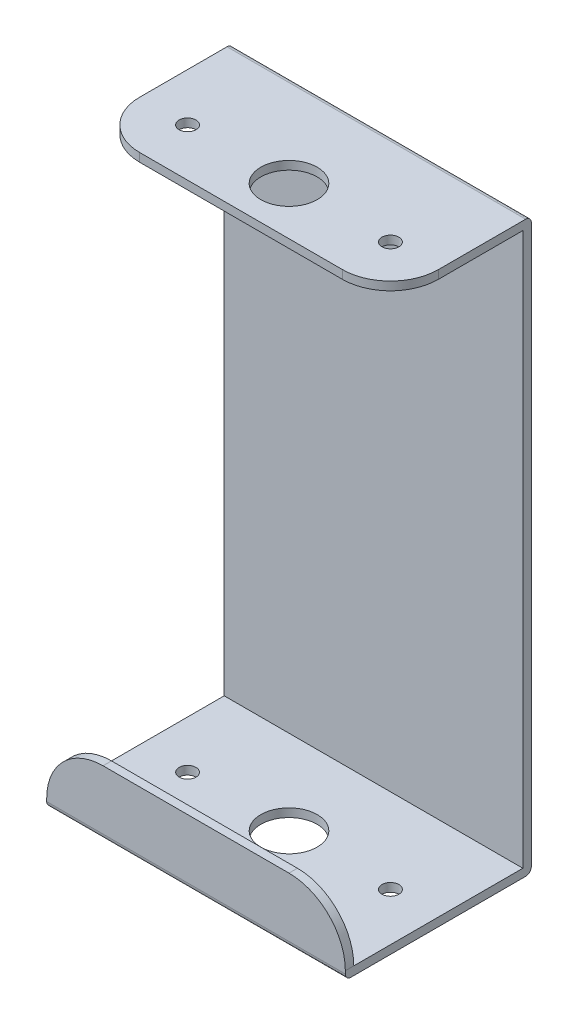
ISO-10303-21;
HEADER;
FILE_DESCRIPTION(('STEP AP214'),'2;1');
FILE_NAME('part.step','',(''),(''),'','','');
FILE_SCHEMA(('AUTOMOTIVE_DESIGN { 1 0 10303 214 1 1 1 1 }'));
ENDSEC;
DATA;
#1=APPLICATION_CONTEXT('core data for automotive mechanical design processes');
#2=APPLICATION_PROTOCOL_DEFINITION('international standard','automotive_design',2000,#1);
#3=PRODUCT_CONTEXT('',#1,'mechanical');
#4=PRODUCT('Part','Part','',(#3));
#5=PRODUCT_RELATED_PRODUCT_CATEGORY('part','',(#4));
#6=PRODUCT_DEFINITION_FORMATION('','',#4);
#7=PRODUCT_DEFINITION_CONTEXT('part definition',#1,'design');
#8=PRODUCT_DEFINITION('design','',#6,#7);
#9=PRODUCT_DEFINITION_SHAPE('','',#8);
#10=(LENGTH_UNIT() NAMED_UNIT(*) SI_UNIT(.MILLI.,.METRE.));
#11=(NAMED_UNIT(*) PLANE_ANGLE_UNIT() SI_UNIT($,.RADIAN.));
#12=(NAMED_UNIT(*) SI_UNIT($,.STERADIAN.) SOLID_ANGLE_UNIT());
#13=UNCERTAINTY_MEASURE_WITH_UNIT(LENGTH_MEASURE(1.E-05),#10,'distance_accuracy_value','');
#14=(GEOMETRIC_REPRESENTATION_CONTEXT(3) GLOBAL_UNCERTAINTY_ASSIGNED_CONTEXT((#13)) GLOBAL_UNIT_ASSIGNED_CONTEXT((#10,
#11,#12)) REPRESENTATION_CONTEXT('',''));
#15=CARTESIAN_POINT('',(0.,0.,0.));
#16=DIRECTION('',(0.,0.,1.));
#17=DIRECTION('',(1.,0.,0.));
#18=AXIS2_PLACEMENT_3D('',#15,#16,#17);
#19=CARTESIAN_POINT('',(-35.3950279955207,-47.290078387458,1.5));
#20=DIRECTION('',(-1.,0.,0.));
#21=DIRECTION('',(0.,0.,1.));
#22=AXIS2_PLACEMENT_3D('',#19,#20,#21);
#23=PLANE('',#22);
#24=DIRECTION('',(0.,1.,0.));
#25=VECTOR('',#24,1.);
#26=CARTESIAN_POINT('',(-35.3950279955207,-47.290078387458,33.));
#27=LINE('',#26,#25);
#28=CARTESIAN_POINT('',(-35.3950279955207,-46.290078387458,33.));
#29=VERTEX_POINT('',#28);
#30=CARTESIAN_POINT('',(-35.3950279955207,-45.790078387458,33.));
#31=VERTEX_POINT('',#30);
#32=EDGE_CURVE('E221',#29,#31,#27,.T.);
#33=ORIENTED_EDGE('',*,*,#32,.T.);
#34=DIRECTION('',(0.,0.,-1.));
#35=VECTOR('',#34,1.);
#36=CARTESIAN_POINT('',(-35.3950279955207,-45.790078387458,202.04901254514));
#37=LINE('',#36,#35);
#38=CARTESIAN_POINT('',(-35.3950279955207,-45.790078387458,31.5));
#39=VERTEX_POINT('',#38);
#40=EDGE_CURVE('E171',#31,#39,#37,.T.);
#41=ORIENTED_EDGE('',*,*,#40,.T.);
#42=DIRECTION('',(0.,0.,-1.));
#43=VECTOR('',#42,1.);
#44=CARTESIAN_POINT('',(-35.3950279955207,-45.790078387458,33.));
#45=LINE('',#44,#43);
#46=CARTESIAN_POINT('',(-35.3950279955207,-45.790078387458,1.5));
#47=VERTEX_POINT('',#46);
#48=EDGE_CURVE('E224',#39,#47,#45,.T.);
#49=ORIENTED_EDGE('',*,*,#48,.T.);
#50=DIRECTION('',(0.,1.,0.));
#51=VECTOR('',#50,1.);
#52=CARTESIAN_POINT('',(-35.3950279955207,-47.290078387458,1.5));
#53=LINE('',#52,#51);
#54=CARTESIAN_POINT('',(-35.3950279955207,52.209921612542,1.5));
#55=VERTEX_POINT('',#54);
#56=EDGE_CURVE('E241',#47,#55,#53,.T.);
#57=ORIENTED_EDGE('',*,*,#56,.T.);
#58=DIRECTION('',(0.,0.,-1.));
#59=VECTOR('',#58,1.);
#60=CARTESIAN_POINT('',(-35.3950279955207,52.209921612542,33.));
#61=LINE('',#60,#59);
#62=CARTESIAN_POINT('',(-35.3950279955207,52.209921612542,16.5));
#63=VERTEX_POINT('',#62);
#64=EDGE_CURVE('E235',#63,#55,#61,.T.);
#65=ORIENTED_EDGE('',*,*,#64,.F.);
#66=DIRECTION('',(0.,1.,0.));
#67=VECTOR('',#66,1.);
#68=CARTESIAN_POINT('',(-35.3950279955207,43.709921612542,16.5));
#69=LINE('',#68,#67);
#70=CARTESIAN_POINT('',(-35.3950279955207,53.709921612542,16.5));
#71=VERTEX_POINT('',#70);
#72=EDGE_CURVE('E185',#63,#71,#69,.T.);
#73=ORIENTED_EDGE('',*,*,#72,.T.);
#74=DIRECTION('',(0.,0.,-1.));
#75=VECTOR('',#74,1.);
#76=CARTESIAN_POINT('',(-35.3950279955207,53.709921612542,1.5));
#77=LINE('',#76,#75);
#78=CARTESIAN_POINT('',(-35.3950279955207,53.709921612542,1.));
#79=VERTEX_POINT('',#78);
#80=EDGE_CURVE('E249',#71,#79,#77,.T.);
#81=ORIENTED_EDGE('',*,*,#80,.T.);
#82=CARTESIAN_POINT('',(-35.3950279955207,52.709921612542,1.));
#83=DIRECTION('',(-1.,0.,0.));
#84=DIRECTION('',(0.,0.,1.));
#85=AXIS2_PLACEMENT_3D('',#82,#83,#84);
#86=CIRCLE('',#85,1.);
#87=CARTESIAN_POINT('',(-35.3950279955207,52.709921612542,0.));
#88=VERTEX_POINT('',#87);
#89=EDGE_CURVE('E268',#79,#88,#86,.T.);
#90=ORIENTED_EDGE('',*,*,#89,.T.);
#91=DIRECTION('',(0.,1.,0.));
#92=VECTOR('',#91,1.);
#93=CARTESIAN_POINT('',(-35.3950279955207,-47.290078387458,0.));
#94=LINE('',#93,#92);
#95=CARTESIAN_POINT('',(-35.3950279955207,-46.290078387458,0.));
#96=VERTEX_POINT('',#95);
#97=EDGE_CURVE('E242',#96,#88,#94,.T.);
#98=ORIENTED_EDGE('',*,*,#97,.F.);
#99=CARTESIAN_POINT('',(-35.3950279955207,-46.290078387458,1.));
#100=DIRECTION('',(-1.,0.,0.));
#101=DIRECTION('',(0.,0.,1.));
#102=AXIS2_PLACEMENT_3D('',#99,#100,#101);
#103=CIRCLE('',#102,1.);
#104=CARTESIAN_POINT('',(-35.3950279955207,-47.290078387458,1.));
#105=VERTEX_POINT('',#104);
#106=EDGE_CURVE('E287',#96,#105,#103,.T.);
#107=ORIENTED_EDGE('',*,*,#106,.T.);
#108=DIRECTION('',(0.,0.,-1.));
#109=VECTOR('',#108,1.);
#110=CARTESIAN_POINT('',(-35.3950279955207,-47.290078387458,1.5));
#111=LINE('',#110,#109);
#112=CARTESIAN_POINT('',(-35.3950279955207,-47.290078387458,32.));
#113=VERTEX_POINT('',#112);
#114=EDGE_CURVE('E245',#113,#105,#111,.T.);
#115=ORIENTED_EDGE('',*,*,#114,.F.);
#116=CARTESIAN_POINT('',(-35.3950279955207,-46.290078387458,32.));
#117=DIRECTION('',(-1.,0.,0.));
#118=DIRECTION('',(0.,0.,1.));
#119=AXIS2_PLACEMENT_3D('',#116,#117,#118);
#120=CIRCLE('',#119,1.);
#121=EDGE_CURVE('E299',#113,#29,#120,.T.);
#122=ORIENTED_EDGE('',*,*,#121,.T.);
#123=EDGE_LOOP('',(#33,#41,#49,#57,#65,#73,#81,#90,#98,#107,#115,#122));
#124=FACE_BOUND('',#123,.T.);
#125=ADVANCED_FACE('F33',(#124),#23,.T.);
#126=CARTESIAN_POINT('',(0.,0.,33.));
#127=DIRECTION('',(0.,0.,-1.));
#128=DIRECTION('',(-1.,0.,0.));
#129=AXIS2_PLACEMENT_3D('',#126,#127,#128);
#130=PLANE('',#129);
#131=DIRECTION('',(0.,-1.,0.));
#132=VECTOR('',#131,1.);
#133=CARTESIAN_POINT('',(17.6049720044793,-45.790078387458,33.));
#134=LINE('',#133,#132);
#135=CARTESIAN_POINT('',(17.6049720044793,-45.790078387458,33.));
#136=VERTEX_POINT('',#135);
#137=CARTESIAN_POINT('',(17.6049720044793,-46.290078387458,33.));
#138=VERTEX_POINT('',#137);
#139=EDGE_CURVE('E158',#136,#138,#134,.T.);
#140=ORIENTED_EDGE('',*,*,#139,.F.);
#141=CARTESIAN_POINT('',(7.60497200447925,-45.790078387458,33.));
#142=DIRECTION('',(0.,0.,-1.));
#143=DIRECTION('',(-1.,0.,0.));
#144=AXIS2_PLACEMENT_3D('',#141,#142,#143);
#145=CIRCLE('',#144,10.);
#146=CARTESIAN_POINT('',(7.60497200447925,-35.790078387458,33.));
#147=VERTEX_POINT('',#146);
#148=EDGE_CURVE('E155',#147,#136,#145,.T.);
#149=ORIENTED_EDGE('',*,*,#148,.F.);
#150=DIRECTION('',(1.,0.,0.));
#151=VECTOR('',#150,1.);
#152=CARTESIAN_POINT('',(-35.3950279955207,-35.790078387458,33.));
#153=LINE('',#152,#151);
#154=CARTESIAN_POINT('',(-25.3950279955207,-35.790078387458,33.));
#155=VERTEX_POINT('',#154);
#156=EDGE_CURVE('E144',#155,#147,#153,.T.);
#157=ORIENTED_EDGE('',*,*,#156,.F.);
#158=CARTESIAN_POINT('',(-25.3950279955207,-45.790078387458,33.));
#159=DIRECTION('',(0.,0.,-1.));
#160=DIRECTION('',(-1.,0.,0.));
#161=AXIS2_PLACEMENT_3D('',#158,#159,#160);
#162=CIRCLE('',#161,10.);
#163=EDGE_CURVE('E168',#155,#31,#162,.F.);
#164=ORIENTED_EDGE('',*,*,#163,.T.);
#165=ORIENTED_EDGE('',*,*,#32,.F.);
#166=DIRECTION('',(-1.,0.,0.));
#167=VECTOR('',#166,1.);
#168=CARTESIAN_POINT('',(0.,-46.290078387458,33.));
#169=LINE('',#168,#167);
#170=EDGE_CURVE('E295',#29,#138,#169,.F.);
#171=ORIENTED_EDGE('',*,*,#170,.T.);
#172=EDGE_LOOP('',(#140,#149,#157,#164,#165,#171));
#173=FACE_BOUND('',#172,.T.);
#174=ADVANCED_FACE('F156',(#173),#130,.F.);
#175=CARTESIAN_POINT('',(17.6049720044793,-35.790078387458,31.5));
#176=DIRECTION('',(0.,0.,1.));
#177=DIRECTION('',(1.,0.,0.));
#178=AXIS2_PLACEMENT_3D('',#175,#176,#177);
#179=PLANE('',#178);
#180=DIRECTION('',(-1.,0.,0.));
#181=VECTOR('',#180,1.);
#182=CARTESIAN_POINT('',(17.6049720044793,-35.790078387458,31.5));
#183=LINE('',#182,#181);
#184=CARTESIAN_POINT('',(7.60497200447925,-35.790078387458,31.5));
#185=VERTEX_POINT('',#184);
#186=CARTESIAN_POINT('',(-25.3950279955207,-35.790078387458,31.5));
#187=VERTEX_POINT('',#186);
#188=EDGE_CURVE('E152',#185,#187,#183,.T.);
#189=ORIENTED_EDGE('',*,*,#188,.F.);
#190=CARTESIAN_POINT('',(7.60497200447925,-45.790078387458,31.5));
#191=DIRECTION('',(0.,0.,1.));
#192=DIRECTION('',(1.,0.,0.));
#193=AXIS2_PLACEMENT_3D('',#190,#191,#192);
#194=CIRCLE('',#193,10.);
#195=CARTESIAN_POINT('',(17.6049720044793,-45.790078387458,31.5));
#196=VERTEX_POINT('',#195);
#197=EDGE_CURVE('E163',#185,#196,#194,.F.);
#198=ORIENTED_EDGE('',*,*,#197,.T.);
#199=DIRECTION('',(-1.,0.,0.));
#200=VECTOR('',#199,1.);
#201=CARTESIAN_POINT('',(17.6049720044793,-45.790078387458,31.5));
#202=LINE('',#201,#200);
#203=EDGE_CURVE('E215',#196,#39,#202,.T.);
#204=ORIENTED_EDGE('',*,*,#203,.T.);
#205=CARTESIAN_POINT('',(-25.3950279955207,-45.790078387458,31.5));
#206=DIRECTION('',(0.,0.,1.));
#207=DIRECTION('',(1.,0.,0.));
#208=AXIS2_PLACEMENT_3D('',#205,#206,#207);
#209=CIRCLE('',#208,10.);
#210=EDGE_CURVE('E173',#187,#39,#209,.T.);
#211=ORIENTED_EDGE('',*,*,#210,.F.);
#212=EDGE_LOOP('',(#189,#198,#204,#211));
#213=FACE_BOUND('',#212,.T.);
#214=ADVANCED_FACE('F341',(#213),#179,.F.);
#215=CARTESIAN_POINT('',(17.6049720044793,-47.290078387458,1.5));
#216=DIRECTION('',(-1.,0.,0.));
#217=DIRECTION('',(0.,0.,1.));
#218=AXIS2_PLACEMENT_3D('',#215,#216,#217);
#219=PLANE('',#218);
#220=DIRECTION('',(0.,0.,-1.));
#221=VECTOR('',#220,1.);
#222=CARTESIAN_POINT('',(17.6049720044793,-45.790078387458,33.));
#223=LINE('',#222,#221);
#224=CARTESIAN_POINT('',(17.6049720044793,-45.790078387458,1.5));
#225=VERTEX_POINT('',#224);
#226=EDGE_CURVE('E228',#196,#225,#223,.T.);
#227=ORIENTED_EDGE('',*,*,#226,.F.);
#228=DIRECTION('',(0.,0.,-1.));
#229=VECTOR('',#228,1.);
#230=CARTESIAN_POINT('',(17.6049720044793,-45.790078387458,181.42401254514));
#231=LINE('',#230,#229);
#232=EDGE_CURVE('E48',#136,#196,#231,.T.);
#233=ORIENTED_EDGE('',*,*,#232,.F.);
#234=ORIENTED_EDGE('',*,*,#139,.T.);
#235=CARTESIAN_POINT('',(17.6049720044793,-46.290078387458,32.));
#236=DIRECTION('',(-1.,0.,0.));
#237=DIRECTION('',(0.,0.,1.));
#238=AXIS2_PLACEMENT_3D('',#235,#236,#237);
#239=CIRCLE('',#238,1.);
#240=CARTESIAN_POINT('',(17.6049720044793,-47.290078387458,32.));
#241=VERTEX_POINT('',#240);
#242=EDGE_CURVE('E297',#138,#241,#239,.F.);
#243=ORIENTED_EDGE('',*,*,#242,.T.);
#244=DIRECTION('',(0.,0.,-1.));
#245=VECTOR('',#244,1.);
#246=CARTESIAN_POINT('',(17.6049720044793,-47.290078387458,1.5));
#247=LINE('',#246,#245);
#248=CARTESIAN_POINT('',(17.6049720044793,-47.290078387458,1.));
#249=VERTEX_POINT('',#248);
#250=EDGE_CURVE('E253',#241,#249,#247,.T.);
#251=ORIENTED_EDGE('',*,*,#250,.T.);
#252=CARTESIAN_POINT('',(17.6049720044793,-46.290078387458,1.));
#253=DIRECTION('',(-1.,0.,0.));
#254=DIRECTION('',(0.,0.,1.));
#255=AXIS2_PLACEMENT_3D('',#252,#253,#254);
#256=CIRCLE('',#255,1.);
#257=CARTESIAN_POINT('',(17.6049720044793,-46.290078387458,0.));
#258=VERTEX_POINT('',#257);
#259=EDGE_CURVE('E290',#249,#258,#256,.F.);
#260=ORIENTED_EDGE('',*,*,#259,.T.);
#261=DIRECTION('',(0.,1.,0.));
#262=VECTOR('',#261,1.);
#263=CARTESIAN_POINT('',(17.6049720044793,-47.290078387458,0.));
#264=LINE('',#263,#262);
#265=CARTESIAN_POINT('',(17.6049720044793,52.709921612542,0.));
#266=VERTEX_POINT('',#265);
#267=EDGE_CURVE('E237',#258,#266,#264,.T.);
#268=ORIENTED_EDGE('',*,*,#267,.T.);
#269=CARTESIAN_POINT('',(17.6049720044793,52.709921612542,1.));
#270=DIRECTION('',(-1.,0.,0.));
#271=DIRECTION('',(0.,0.,1.));
#272=AXIS2_PLACEMENT_3D('',#269,#270,#271);
#273=CIRCLE('',#272,1.);
#274=CARTESIAN_POINT('',(17.6049720044793,53.709921612542,1.));
#275=VERTEX_POINT('',#274);
#276=EDGE_CURVE('E271',#266,#275,#273,.F.);
#277=ORIENTED_EDGE('',*,*,#276,.T.);
#278=DIRECTION('',(0.,0.,-1.));
#279=VECTOR('',#278,1.);
#280=CARTESIAN_POINT('',(17.6049720044793,53.709921612542,1.5));
#281=LINE('',#280,#279);
#282=CARTESIAN_POINT('',(17.6049720044793,53.709921612542,16.5));
#283=VERTEX_POINT('',#282);
#284=EDGE_CURVE('E251',#283,#275,#281,.T.);
#285=ORIENTED_EDGE('',*,*,#284,.F.);
#286=DIRECTION('',(0.,1.,0.));
#287=VECTOR('',#286,1.);
#288=CARTESIAN_POINT('',(17.6049720044793,43.709921612542,16.5));
#289=LINE('',#288,#287);
#290=CARTESIAN_POINT('',(17.6049720044793,52.209921612542,16.5));
#291=VERTEX_POINT('',#290);
#292=EDGE_CURVE('E191',#291,#283,#289,.T.);
#293=ORIENTED_EDGE('',*,*,#292,.F.);
#294=DIRECTION('',(0.,0.,-1.));
#295=VECTOR('',#294,1.);
#296=CARTESIAN_POINT('',(17.6049720044793,52.209921612542,33.));
#297=LINE('',#296,#295);
#298=CARTESIAN_POINT('',(17.6049720044793,52.209921612542,1.5));
#299=VERTEX_POINT('',#298);
#300=EDGE_CURVE('E233',#291,#299,#297,.T.);
#301=ORIENTED_EDGE('',*,*,#300,.T.);
#302=DIRECTION('',(0.,1.,0.));
#303=VECTOR('',#302,1.);
#304=CARTESIAN_POINT('',(17.6049720044793,-47.290078387458,1.5));
#305=LINE('',#304,#303);
#306=EDGE_CURVE('E238',#225,#299,#305,.T.);
#307=ORIENTED_EDGE('',*,*,#306,.F.);
#308=EDGE_LOOP('',(#227,#233,#234,#243,#251,#260,#268,#277,#285,#293,#301,#307));
#309=FACE_BOUND('',#308,.T.);
#310=ADVANCED_FACE('F318',(#309),#219,.F.);
#311=CARTESIAN_POINT('',(-35.3950279955207,53.709921612542,1.5));
#312=DIRECTION('',(0.,1.,0.));
#313=DIRECTION('',(0.,0.,1.));
#314=AXIS2_PLACEMENT_3D('',#311,#312,#313);
#315=PLANE('',#314);
#316=CARTESIAN_POINT('',(-26.8950279955207,53.709921612542,16.5));
#317=DIRECTION('',(0.,1.,0.));
#318=DIRECTION('',(0.,0.,1.));
#319=AXIS2_PLACEMENT_3D('',#316,#317,#318);
#320=CIRCLE('',#319,1.5);
#321=CARTESIAN_POINT('',(-26.8950279955207,53.709921612542,18.));
#322=VERTEX_POINT('',#321);
#323=EDGE_CURVE('E208',#322,#322,#320,.T.);
#324=ORIENTED_EDGE('',*,*,#323,.F.);
#325=EDGE_LOOP('',(#324));
#326=FACE_BOUND('',#325,.T.);
#327=CARTESIAN_POINT('',(9.10497200447925,53.709921612542,16.5));
#328=DIRECTION('',(0.,1.,0.));
#329=DIRECTION('',(0.,0.,1.));
#330=AXIS2_PLACEMENT_3D('',#327,#328,#329);
#331=CIRCLE('',#330,1.5);
#332=CARTESIAN_POINT('',(9.10497200447925,53.709921612542,18.));
#333=VERTEX_POINT('',#332);
#334=EDGE_CURVE('E204',#333,#333,#331,.T.);
#335=ORIENTED_EDGE('',*,*,#334,.F.);
#336=EDGE_LOOP('',(#335));
#337=FACE_BOUND('',#336,.T.);
#338=CARTESIAN_POINT('',(-8.89502799552074,53.709921612542,16.5));
#339=DIRECTION('',(0.,1.,0.));
#340=DIRECTION('',(0.,0.,1.));
#341=AXIS2_PLACEMENT_3D('',#338,#339,#340);
#342=CIRCLE('',#341,5.);
#343=CARTESIAN_POINT('',(-8.89502799552074,53.709921612542,21.5));
#344=VERTEX_POINT('',#343);
#345=EDGE_CURVE('E207',#344,#344,#342,.T.);
#346=ORIENTED_EDGE('',*,*,#345,.F.);
#347=EDGE_LOOP('',(#346));
#348=FACE_BOUND('',#347,.T.);
#349=ORIENTED_EDGE('',*,*,#80,.F.);
#350=CARTESIAN_POINT('',(-26.8950279955207,53.709921612542,16.5));
#351=DIRECTION('',(0.,1.,0.));
#352=DIRECTION('',(0.,0.,1.));
#353=AXIS2_PLACEMENT_3D('',#350,#351,#352);
#354=CIRCLE('',#353,8.5);
#355=CARTESIAN_POINT('',(-26.8950279955207,53.709921612542,25.));
#356=VERTEX_POINT('',#355);
#357=EDGE_CURVE('E176',#71,#356,#354,.T.);
#358=ORIENTED_EDGE('',*,*,#357,.T.);
#359=DIRECTION('',(1.,0.,0.));
#360=VECTOR('',#359,1.);
#361=CARTESIAN_POINT('',(0.,53.709921612542,25.));
#362=LINE('',#361,#360);
#363=CARTESIAN_POINT('',(9.10497200447925,53.709921612542,25.));
#364=VERTEX_POINT('',#363);
#365=EDGE_CURVE('E182',#356,#364,#362,.T.);
#366=ORIENTED_EDGE('',*,*,#365,.T.);
#367=CARTESIAN_POINT('',(9.10497200447925,53.709921612542,16.5));
#368=DIRECTION('',(0.,1.,0.));
#369=DIRECTION('',(0.,0.,1.));
#370=AXIS2_PLACEMENT_3D('',#367,#368,#369);
#371=CIRCLE('',#370,8.5);
#372=EDGE_CURVE('E179',#364,#283,#371,.T.);
#373=ORIENTED_EDGE('',*,*,#372,.T.);
#374=ORIENTED_EDGE('',*,*,#284,.T.);
#375=DIRECTION('',(1.,0.,0.));
#376=VECTOR('',#375,1.);
#377=CARTESIAN_POINT('',(0.,53.709921612542,1.));
#378=LINE('',#377,#376);
#379=EDGE_CURVE('E265',#275,#79,#378,.F.);
#380=ORIENTED_EDGE('',*,*,#379,.T.);
#381=EDGE_LOOP('',(#349,#358,#366,#373,#374,#380));
#382=FACE_BOUND('',#381,.T.);
#383=ADVANCED_FACE('F324',(#326,#337,#348,#382),#315,.T.);
#384=CARTESIAN_POINT('',(-35.3950279955207,52.209921612542,33.));
#385=DIRECTION('',(0.,1.,0.));
#386=DIRECTION('',(0.,0.,1.));
#387=AXIS2_PLACEMENT_3D('',#384,#385,#386);
#388=PLANE('',#387);
#389=CARTESIAN_POINT('',(-8.89502799552074,52.209921612542,16.5));
#390=DIRECTION('',(0.,1.,0.));
#391=DIRECTION('',(0.,0.,1.));
#392=AXIS2_PLACEMENT_3D('',#389,#390,#391);
#393=CIRCLE('',#392,5.);
#394=CARTESIAN_POINT('',(-8.89502799552074,52.209921612542,21.5));
#395=VERTEX_POINT('',#394);
#396=EDGE_CURVE('E214',#395,#395,#393,.T.);
#397=ORIENTED_EDGE('',*,*,#396,.T.);
#398=EDGE_LOOP('',(#397));
#399=FACE_BOUND('',#398,.T.);
#400=CARTESIAN_POINT('',(9.10497200447925,52.209921612542,16.5));
#401=DIRECTION('',(0.,1.,0.));
#402=DIRECTION('',(0.,0.,1.));
#403=AXIS2_PLACEMENT_3D('',#400,#401,#402);
#404=CIRCLE('',#403,1.5);
#405=CARTESIAN_POINT('',(9.10497200447925,52.209921612542,18.));
#406=VERTEX_POINT('',#405);
#407=EDGE_CURVE('E258',#406,#406,#404,.T.);
#408=ORIENTED_EDGE('',*,*,#407,.T.);
#409=EDGE_LOOP('',(#408));
#410=FACE_BOUND('',#409,.T.);
#411=CARTESIAN_POINT('',(-26.8950279955207,52.209921612542,16.5));
#412=DIRECTION('',(0.,1.,0.));
#413=DIRECTION('',(0.,0.,1.));
#414=AXIS2_PLACEMENT_3D('',#411,#412,#413);
#415=CIRCLE('',#414,1.5);
#416=CARTESIAN_POINT('',(-26.8950279955207,52.209921612542,18.));
#417=VERTEX_POINT('',#416);
#418=EDGE_CURVE('E219',#417,#417,#415,.T.);
#419=ORIENTED_EDGE('',*,*,#418,.T.);
#420=EDGE_LOOP('',(#419));
#421=FACE_BOUND('',#420,.T.);
#422=CARTESIAN_POINT('',(-26.8950279955207,52.209921612542,16.5));
#423=DIRECTION('',(0.,1.,0.));
#424=DIRECTION('',(0.,0.,1.));
#425=AXIS2_PLACEMENT_3D('',#422,#423,#424);
#426=CIRCLE('',#425,8.5);
#427=CARTESIAN_POINT('',(-26.8950279955207,52.209921612542,25.));
#428=VERTEX_POINT('',#427);
#429=EDGE_CURVE('E11',#63,#428,#426,.T.);
#430=ORIENTED_EDGE('',*,*,#429,.F.);
#431=ORIENTED_EDGE('',*,*,#64,.T.);
#432=DIRECTION('',(1.,0.,0.));
#433=VECTOR('',#432,1.);
#434=CARTESIAN_POINT('',(-35.3950279955207,52.209921612542,1.5));
#435=LINE('',#434,#433);
#436=EDGE_CURVE('E230',#55,#299,#435,.T.);
#437=ORIENTED_EDGE('',*,*,#436,.T.);
#438=ORIENTED_EDGE('',*,*,#300,.F.);
#439=CARTESIAN_POINT('',(9.10497200447925,52.209921612542,16.5));
#440=DIRECTION('',(0.,1.,0.));
#441=DIRECTION('',(0.,0.,1.));
#442=AXIS2_PLACEMENT_3D('',#439,#440,#441);
#443=CIRCLE('',#442,8.5);
#444=CARTESIAN_POINT('',(9.10497200447925,52.209921612542,25.));
#445=VERTEX_POINT('',#444);
#446=EDGE_CURVE('E301',#445,#291,#443,.T.);
#447=ORIENTED_EDGE('',*,*,#446,.F.);
#448=DIRECTION('',(1.,0.,0.));
#449=VECTOR('',#448,1.);
#450=CARTESIAN_POINT('',(-35.3950279955207,52.209921612542,25.));
#451=LINE('',#450,#449);
#452=EDGE_CURVE('E41',#428,#445,#451,.T.);
#453=ORIENTED_EDGE('',*,*,#452,.F.);
#454=EDGE_LOOP('',(#430,#431,#437,#438,#447,#453));
#455=FACE_BOUND('',#454,.T.);
#456=ADVANCED_FACE('F313',(#399,#410,#421,#455),#388,.F.);
#457=CARTESIAN_POINT('',(-35.3950279955207,-46.290078387458,32.));
#458=DIRECTION('',(-1.,0.,0.));
#459=DIRECTION('',(0.,0.,1.));
#460=AXIS2_PLACEMENT_3D('',#457,#458,#459);
#461=CYLINDRICAL_SURFACE('',#460,1.);
#462=DIRECTION('',(-1.,0.,0.));
#463=VECTOR('',#462,1.);
#464=CARTESIAN_POINT('',(-35.3950279955207,-47.290078387458,32.));
#465=LINE('',#464,#463);
#466=EDGE_CURVE('E292',#241,#113,#465,.T.);
#467=ORIENTED_EDGE('',*,*,#466,.F.);
#468=ORIENTED_EDGE('',*,*,#242,.F.);
#469=ORIENTED_EDGE('',*,*,#170,.F.);
#470=ORIENTED_EDGE('',*,*,#121,.F.);
#471=EDGE_LOOP('',(#467,#468,#469,#470));
#472=FACE_BOUND('',#471,.T.);
#473=ADVANCED_FACE('F35',(#472),#461,.T.);
#474=CARTESIAN_POINT('',(-35.3950279955207,-46.290078387458,1.));
#475=DIRECTION('',(1.,0.,0.));
#476=DIRECTION('',(0.,0.,-1.));
#477=AXIS2_PLACEMENT_3D('',#474,#475,#476);
#478=CYLINDRICAL_SURFACE('',#477,1.);
#479=DIRECTION('',(1.,0.,0.));
#480=VECTOR('',#479,1.);
#481=CARTESIAN_POINT('',(-35.3950279955207,-47.290078387458,1.));
#482=LINE('',#481,#480);
#483=EDGE_CURVE('E274',#105,#249,#482,.T.);
#484=ORIENTED_EDGE('',*,*,#483,.F.);
#485=ORIENTED_EDGE('',*,*,#106,.F.);
#486=DIRECTION('',(1.,0.,0.));
#487=VECTOR('',#486,1.);
#488=CARTESIAN_POINT('',(0.,-46.290078387458,0.));
#489=LINE('',#488,#487);
#490=EDGE_CURVE('E284',#258,#96,#489,.F.);
#491=ORIENTED_EDGE('',*,*,#490,.F.);
#492=ORIENTED_EDGE('',*,*,#259,.F.);
#493=EDGE_LOOP('',(#484,#485,#491,#492));
#494=FACE_BOUND('',#493,.T.);
#495=ADVANCED_FACE('F357',(#494),#478,.T.);
#496=CARTESIAN_POINT('',(0.,52.709921612542,1.));
#497=DIRECTION('',(-1.,0.,0.));
#498=DIRECTION('',(0.,0.,1.));
#499=AXIS2_PLACEMENT_3D('',#496,#497,#498);
#500=CYLINDRICAL_SURFACE('',#499,1.);
#501=DIRECTION('',(1.,0.,0.));
#502=VECTOR('',#501,1.);
#503=CARTESIAN_POINT('',(0.,52.709921612542,0.));
#504=LINE('',#503,#502);
#505=EDGE_CURVE('E255',#88,#266,#504,.T.);
#506=ORIENTED_EDGE('',*,*,#505,.F.);
#507=ORIENTED_EDGE('',*,*,#89,.F.);
#508=ORIENTED_EDGE('',*,*,#379,.F.);
#509=ORIENTED_EDGE('',*,*,#276,.F.);
#510=EDGE_LOOP('',(#506,#507,#508,#509));
#511=FACE_BOUND('',#510,.T.);
#512=ADVANCED_FACE('F365',(#511),#500,.T.);
#513=CARTESIAN_POINT('',(-35.3950279955207,-45.790078387458,33.));
#514=DIRECTION('',(0.,1.,0.));
#515=DIRECTION('',(0.,0.,1.));
#516=AXIS2_PLACEMENT_3D('',#513,#514,#515);
#517=PLANE('',#516);
#518=CARTESIAN_POINT('',(9.10497200447925,-45.790078387458,16.5));
#519=DIRECTION('',(0.,1.,0.));
#520=DIRECTION('',(0.,0.,1.));
#521=AXIS2_PLACEMENT_3D('',#518,#519,#520);
#522=CIRCLE('',#521,1.5);
#523=CARTESIAN_POINT('',(9.10497200447925,-45.790078387458,18.));
#524=VERTEX_POINT('',#523);
#525=EDGE_CURVE('E188',#524,#524,#522,.T.);
#526=ORIENTED_EDGE('',*,*,#525,.F.);
#527=EDGE_LOOP('',(#526));
#528=FACE_BOUND('',#527,.T.);
#529=CARTESIAN_POINT('',(-26.8950279955207,-45.790078387458,16.5));
#530=DIRECTION('',(0.,1.,0.));
#531=DIRECTION('',(0.,0.,1.));
#532=AXIS2_PLACEMENT_3D('',#529,#530,#531);
#533=CIRCLE('',#532,1.5);
#534=CARTESIAN_POINT('',(-26.8950279955207,-45.790078387458,18.));
#535=VERTEX_POINT('',#534);
#536=EDGE_CURVE('E195',#535,#535,#533,.T.);
#537=ORIENTED_EDGE('',*,*,#536,.F.);
#538=EDGE_LOOP('',(#537));
#539=FACE_BOUND('',#538,.T.);
#540=CARTESIAN_POINT('',(-8.89502799552075,-45.790078387458,16.5));
#541=DIRECTION('',(0.,1.,0.));
#542=DIRECTION('',(0.,0.,1.));
#543=AXIS2_PLACEMENT_3D('',#540,#541,#542);
#544=CIRCLE('',#543,5.);
#545=CARTESIAN_POINT('',(-8.89502799552075,-45.790078387458,21.5));
#546=VERTEX_POINT('',#545);
#547=EDGE_CURVE('E198',#546,#546,#544,.T.);
#548=ORIENTED_EDGE('',*,*,#547,.F.);
#549=EDGE_LOOP('',(#548));
#550=FACE_BOUND('',#549,.T.);
#551=ORIENTED_EDGE('',*,*,#48,.F.);
#552=ORIENTED_EDGE('',*,*,#203,.F.);
#553=ORIENTED_EDGE('',*,*,#226,.T.);
#554=DIRECTION('',(1.,0.,0.));
#555=VECTOR('',#554,1.);
#556=CARTESIAN_POINT('',(-35.3950279955207,-45.790078387458,1.5));
#557=LINE('',#556,#555);
#558=EDGE_CURVE('E151',#47,#225,#557,.T.);
#559=ORIENTED_EDGE('',*,*,#558,.F.);
#560=EDGE_LOOP('',(#551,#552,#553,#559));
#561=FACE_BOUND('',#560,.T.);
#562=ADVANCED_FACE('F338',(#528,#539,#550,#561),#517,.T.);
#563=CARTESIAN_POINT('',(-35.3950279955207,-47.290078387458,1.5));
#564=DIRECTION('',(0.,1.,0.));
#565=DIRECTION('',(0.,0.,1.));
#566=AXIS2_PLACEMENT_3D('',#563,#564,#565);
#567=PLANE('',#566);
#568=CARTESIAN_POINT('',(9.10497200447925,-47.290078387458,16.5));
#569=DIRECTION('',(0.,1.,0.));
#570=DIRECTION('',(0.,0.,1.));
#571=AXIS2_PLACEMENT_3D('',#568,#569,#570);
#572=CIRCLE('',#571,1.5);
#573=CARTESIAN_POINT('',(9.10497200447925,-47.290078387458,18.));
#574=VERTEX_POINT('',#573);
#575=EDGE_CURVE('E211',#574,#574,#572,.T.);
#576=ORIENTED_EDGE('',*,*,#575,.T.);
#577=EDGE_LOOP('',(#576));
#578=FACE_BOUND('',#577,.T.);
#579=CARTESIAN_POINT('',(-26.8950279955207,-47.290078387458,16.5));
#580=DIRECTION('',(0.,1.,0.));
#581=DIRECTION('',(0.,0.,1.));
#582=AXIS2_PLACEMENT_3D('',#579,#580,#581);
#583=CIRCLE('',#582,1.5);
#584=CARTESIAN_POINT('',(-26.8950279955207,-47.290078387458,18.));
#585=VERTEX_POINT('',#584);
#586=EDGE_CURVE('E277',#585,#585,#583,.T.);
#587=ORIENTED_EDGE('',*,*,#586,.T.);
#588=EDGE_LOOP('',(#587));
#589=FACE_BOUND('',#588,.T.);
#590=CARTESIAN_POINT('',(-8.89502799552075,-47.290078387458,16.5));
#591=DIRECTION('',(0.,1.,0.));
#592=DIRECTION('',(0.,0.,1.));
#593=AXIS2_PLACEMENT_3D('',#590,#591,#592);
#594=CIRCLE('',#593,5.);
#595=CARTESIAN_POINT('',(-8.89502799552075,-47.290078387458,21.5));
#596=VERTEX_POINT('',#595);
#597=EDGE_CURVE('E203',#596,#596,#594,.T.);
#598=ORIENTED_EDGE('',*,*,#597,.T.);
#599=EDGE_LOOP('',(#598));
#600=FACE_BOUND('',#599,.T.);
#601=ORIENTED_EDGE('',*,*,#250,.F.);
#602=ORIENTED_EDGE('',*,*,#466,.T.);
#603=ORIENTED_EDGE('',*,*,#114,.T.);
#604=ORIENTED_EDGE('',*,*,#483,.T.);
#605=EDGE_LOOP('',(#601,#602,#603,#604));
#606=FACE_BOUND('',#605,.T.);
#607=ADVANCED_FACE('F359',(#578,#589,#600,#606),#567,.F.);
#608=CARTESIAN_POINT('',(0.,0.,1.5));
#609=DIRECTION('',(0.,0.,1.));
#610=DIRECTION('',(1.,0.,0.));
#611=AXIS2_PLACEMENT_3D('',#608,#609,#610);
#612=PLANE('',#611);
#613=ORIENTED_EDGE('',*,*,#558,.T.);
#614=ORIENTED_EDGE('',*,*,#306,.T.);
#615=ORIENTED_EDGE('',*,*,#436,.F.);
#616=ORIENTED_EDGE('',*,*,#56,.F.);
#617=EDGE_LOOP('',(#613,#614,#615,#616));
#618=FACE_BOUND('',#617,.T.);
#619=ADVANCED_FACE('F333',(#618),#612,.T.);
#620=CARTESIAN_POINT('',(0.,0.,0.));
#621=DIRECTION('',(0.,0.,1.));
#622=DIRECTION('',(1.,0.,0.));
#623=AXIS2_PLACEMENT_3D('',#620,#621,#622);
#624=PLANE('',#623);
#625=ORIENTED_EDGE('',*,*,#267,.F.);
#626=ORIENTED_EDGE('',*,*,#490,.T.);
#627=ORIENTED_EDGE('',*,*,#97,.T.);
#628=ORIENTED_EDGE('',*,*,#505,.T.);
#629=EDGE_LOOP('',(#625,#626,#627,#628));
#630=FACE_BOUND('',#629,.T.);
#631=ADVANCED_FACE('F362',(#630),#624,.F.);
#632=CARTESIAN_POINT('',(0.,-35.790078387458,0.));
#633=DIRECTION('',(0.,1.,0.));
#634=DIRECTION('',(0.,0.,1.));
#635=AXIS2_PLACEMENT_3D('',#632,#633,#634);
#636=PLANE('',#635);
#637=DIRECTION('',(0.,0.,-1.));
#638=VECTOR('',#637,1.);
#639=CARTESIAN_POINT('',(7.60497200447925,-35.790078387458,181.42401254514));
#640=LINE('',#639,#638);
#641=EDGE_CURVE('E56',#147,#185,#640,.T.);
#642=ORIENTED_EDGE('',*,*,#641,.T.);
#643=ORIENTED_EDGE('',*,*,#188,.T.);
#644=DIRECTION('',(0.,0.,-1.));
#645=VECTOR('',#644,1.);
#646=CARTESIAN_POINT('',(-25.3950279955207,-35.790078387458,202.04901254514));
#647=LINE('',#646,#645);
#648=EDGE_CURVE('E148',#155,#187,#647,.T.);
#649=ORIENTED_EDGE('',*,*,#648,.F.);
#650=ORIENTED_EDGE('',*,*,#156,.T.);
#651=EDGE_LOOP('',(#642,#643,#649,#650));
#652=FACE_BOUND('',#651,.T.);
#653=ADVANCED_FACE('F146',(#652),#636,.T.);
#654=CARTESIAN_POINT('',(-8.89502799552074,43.709921612542,16.5));
#655=DIRECTION('',(0.,1.,0.));
#656=DIRECTION('',(0.,0.,1.));
#657=AXIS2_PLACEMENT_3D('',#654,#655,#656);
#658=CYLINDRICAL_SURFACE('',#657,5.);
#659=ORIENTED_EDGE('',*,*,#345,.T.);
#660=EDGE_LOOP('',(#659));
#661=FACE_BOUND('',#660,.T.);
#662=ORIENTED_EDGE('',*,*,#396,.F.);
#663=EDGE_LOOP('',(#662));
#664=FACE_BOUND('',#663,.T.);
#665=ADVANCED_FACE('F421',(#661,#664),#658,.F.);
#666=CARTESIAN_POINT('',(9.10497200447925,43.709921612542,16.5));
#667=DIRECTION('',(0.,1.,0.));
#668=DIRECTION('',(0.,0.,1.));
#669=AXIS2_PLACEMENT_3D('',#666,#667,#668);
#670=CYLINDRICAL_SURFACE('',#669,1.5);
#671=ORIENTED_EDGE('',*,*,#334,.T.);
#672=EDGE_LOOP('',(#671));
#673=FACE_BOUND('',#672,.T.);
#674=ORIENTED_EDGE('',*,*,#407,.F.);
#675=EDGE_LOOP('',(#674));
#676=FACE_BOUND('',#675,.T.);
#677=ADVANCED_FACE('F415',(#673,#676),#670,.F.);
#678=CARTESIAN_POINT('',(-26.8950279955207,43.709921612542,16.5));
#679=DIRECTION('',(0.,1.,0.));
#680=DIRECTION('',(0.,0.,1.));
#681=AXIS2_PLACEMENT_3D('',#678,#679,#680);
#682=CYLINDRICAL_SURFACE('',#681,1.5);
#683=ORIENTED_EDGE('',*,*,#323,.T.);
#684=EDGE_LOOP('',(#683));
#685=FACE_BOUND('',#684,.T.);
#686=ORIENTED_EDGE('',*,*,#418,.F.);
#687=EDGE_LOOP('',(#686));
#688=FACE_BOUND('',#687,.T.);
#689=ADVANCED_FACE('F405',(#685,#688),#682,.F.);
#690=CARTESIAN_POINT('',(-8.89502799552075,-55.790078387458,16.5));
#691=DIRECTION('',(0.,1.,0.));
#692=DIRECTION('',(0.,0.,1.));
#693=AXIS2_PLACEMENT_3D('',#690,#691,#692);
#694=CYLINDRICAL_SURFACE('',#693,5.);
#695=ORIENTED_EDGE('',*,*,#547,.T.);
#696=EDGE_LOOP('',(#695));
#697=FACE_BOUND('',#696,.T.);
#698=ORIENTED_EDGE('',*,*,#597,.F.);
#699=EDGE_LOOP('',(#698));
#700=FACE_BOUND('',#699,.T.);
#701=ADVANCED_FACE('F402',(#697,#700),#694,.F.);
#702=CARTESIAN_POINT('',(-26.8950279955207,-55.790078387458,16.5));
#703=DIRECTION('',(0.,1.,0.));
#704=DIRECTION('',(0.,0.,1.));
#705=AXIS2_PLACEMENT_3D('',#702,#703,#704);
#706=CYLINDRICAL_SURFACE('',#705,1.5);
#707=ORIENTED_EDGE('',*,*,#536,.T.);
#708=EDGE_LOOP('',(#707));
#709=FACE_BOUND('',#708,.T.);
#710=ORIENTED_EDGE('',*,*,#586,.F.);
#711=EDGE_LOOP('',(#710));
#712=FACE_BOUND('',#711,.T.);
#713=ADVANCED_FACE('F404',(#709,#712),#706,.F.);
#714=CARTESIAN_POINT('',(9.10497200447925,-55.790078387458,16.5));
#715=DIRECTION('',(0.,1.,0.));
#716=DIRECTION('',(0.,0.,1.));
#717=AXIS2_PLACEMENT_3D('',#714,#715,#716);
#718=CYLINDRICAL_SURFACE('',#717,1.5);
#719=ORIENTED_EDGE('',*,*,#525,.T.);
#720=EDGE_LOOP('',(#719));
#721=FACE_BOUND('',#720,.T.);
#722=ORIENTED_EDGE('',*,*,#575,.F.);
#723=EDGE_LOOP('',(#722));
#724=FACE_BOUND('',#723,.T.);
#725=ADVANCED_FACE('F412',(#721,#724),#718,.F.);
#726=CARTESIAN_POINT('',(-26.8950279955207,43.709921612542,16.5));
#727=DIRECTION('',(0.,1.,0.));
#728=DIRECTION('',(0.,0.,1.));
#729=AXIS2_PLACEMENT_3D('',#726,#727,#728);
#730=CYLINDRICAL_SURFACE('',#729,8.5);
#731=ORIENTED_EDGE('',*,*,#429,.T.);
#732=DIRECTION('',(0.,1.,0.));
#733=VECTOR('',#732,1.);
#734=CARTESIAN_POINT('',(-26.8950279955207,43.709921612542,25.));
#735=LINE('',#734,#733);
#736=EDGE_CURVE('E186',#428,#356,#735,.T.);
#737=ORIENTED_EDGE('',*,*,#736,.T.);
#738=ORIENTED_EDGE('',*,*,#357,.F.);
#739=ORIENTED_EDGE('',*,*,#72,.F.);
#740=EDGE_LOOP('',(#731,#737,#738,#739));
#741=FACE_BOUND('',#740,.T.);
#742=ADVANCED_FACE('F326',(#741),#730,.T.);
#743=CARTESIAN_POINT('',(0.,43.709921612542,25.));
#744=DIRECTION('',(0.,0.,1.));
#745=DIRECTION('',(1.,0.,0.));
#746=AXIS2_PLACEMENT_3D('',#743,#744,#745);
#747=PLANE('',#746);
#748=ORIENTED_EDGE('',*,*,#452,.T.);
#749=DIRECTION('',(0.,1.,0.));
#750=VECTOR('',#749,1.);
#751=CARTESIAN_POINT('',(9.10497200447925,43.709921612542,25.));
#752=LINE('',#751,#750);
#753=EDGE_CURVE('E189',#445,#364,#752,.T.);
#754=ORIENTED_EDGE('',*,*,#753,.T.);
#755=ORIENTED_EDGE('',*,*,#365,.F.);
#756=ORIENTED_EDGE('',*,*,#736,.F.);
#757=EDGE_LOOP('',(#748,#754,#755,#756));
#758=FACE_BOUND('',#757,.T.);
#759=ADVANCED_FACE('F307',(#758),#747,.T.);
#760=CARTESIAN_POINT('',(9.10497200447925,43.709921612542,16.5));
#761=DIRECTION('',(0.,1.,0.));
#762=DIRECTION('',(0.,0.,1.));
#763=AXIS2_PLACEMENT_3D('',#760,#761,#762);
#764=CYLINDRICAL_SURFACE('',#763,8.5);
#765=ORIENTED_EDGE('',*,*,#446,.T.);
#766=ORIENTED_EDGE('',*,*,#292,.T.);
#767=ORIENTED_EDGE('',*,*,#372,.F.);
#768=ORIENTED_EDGE('',*,*,#753,.F.);
#769=EDGE_LOOP('',(#765,#766,#767,#768));
#770=FACE_BOUND('',#769,.T.);
#771=ADVANCED_FACE('F316',(#770),#764,.T.);
#772=CARTESIAN_POINT('',(-25.3950279955207,-45.790078387458,202.04901254514));
#773=DIRECTION('',(0.,0.,-1.));
#774=DIRECTION('',(-1.,0.,0.));
#775=AXIS2_PLACEMENT_3D('',#772,#773,#774);
#776=CYLINDRICAL_SURFACE('',#775,10.);
#777=ORIENTED_EDGE('',*,*,#648,.T.);
#778=ORIENTED_EDGE('',*,*,#210,.T.);
#779=ORIENTED_EDGE('',*,*,#40,.F.);
#780=ORIENTED_EDGE('',*,*,#163,.F.);
#781=EDGE_LOOP('',(#777,#778,#779,#780));
#782=FACE_BOUND('',#781,.T.);
#783=ADVANCED_FACE('F344',(#782),#776,.T.);
#784=CARTESIAN_POINT('',(7.60497200447925,-45.790078387458,181.42401254514));
#785=DIRECTION('',(0.,0.,-1.));
#786=DIRECTION('',(-1.,0.,0.));
#787=AXIS2_PLACEMENT_3D('',#784,#785,#786);
#788=CYLINDRICAL_SURFACE('',#787,10.);
#789=ORIENTED_EDGE('',*,*,#197,.F.);
#790=ORIENTED_EDGE('',*,*,#641,.F.);
#791=ORIENTED_EDGE('',*,*,#148,.T.);
#792=ORIENTED_EDGE('',*,*,#232,.T.);
#793=EDGE_LOOP('',(#789,#790,#791,#792));
#794=FACE_BOUND('',#793,.T.);
#795=ADVANCED_FACE('F162',(#794),#788,.T.);
#796=CLOSED_SHELL('',(#125,#174,#214,#310,#383,#456,#473,#495,#512,#562,#607,#619,#631,#653,
#665,#677,#689,#701,#713,#725,#742,#759,#771,#783,#795));
#797=MANIFOLD_SOLID_BREP('B2',#796);
#798=ADVANCED_BREP_SHAPE_REPRESENTATION('',(#18,#797),#14);
#799=SHAPE_DEFINITION_REPRESENTATION(#9,#798);
ENDSEC;
END-ISO-10303-21;
